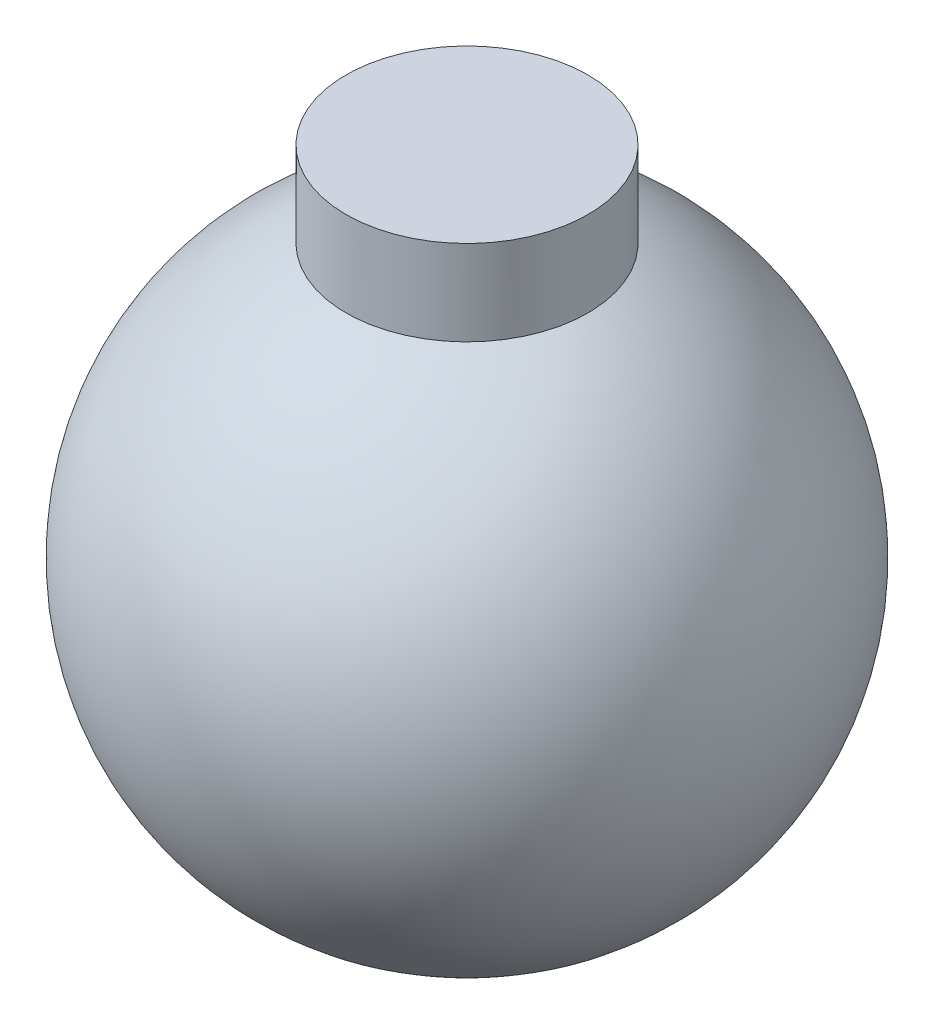
ISO-10303-21;
HEADER;
FILE_DESCRIPTION(('STEP AP214'),'2;1');
FILE_NAME('part.step','',(''),(''),'','','');
FILE_SCHEMA(('AUTOMOTIVE_DESIGN { 1 0 10303 214 1 1 1 1 }'));
ENDSEC;
DATA;
#1=APPLICATION_CONTEXT('core data for automotive mechanical design processes');
#2=APPLICATION_PROTOCOL_DEFINITION('international standard','automotive_design',2000,#1);
#3=PRODUCT_CONTEXT('',#1,'mechanical');
#4=PRODUCT('Part','Part','',(#3));
#5=PRODUCT_RELATED_PRODUCT_CATEGORY('part','',(#4));
#6=PRODUCT_DEFINITION_FORMATION('','',#4);
#7=PRODUCT_DEFINITION_CONTEXT('part definition',#1,'design');
#8=PRODUCT_DEFINITION('design','',#6,#7);
#9=PRODUCT_DEFINITION_SHAPE('','',#8);
#10=(LENGTH_UNIT() NAMED_UNIT(*) SI_UNIT(.MILLI.,.METRE.));
#11=(NAMED_UNIT(*) PLANE_ANGLE_UNIT() SI_UNIT($,.RADIAN.));
#12=(NAMED_UNIT(*) SI_UNIT($,.STERADIAN.) SOLID_ANGLE_UNIT());
#13=UNCERTAINTY_MEASURE_WITH_UNIT(LENGTH_MEASURE(1.E-05),#10,'distance_accuracy_value','');
#14=(GEOMETRIC_REPRESENTATION_CONTEXT(3) GLOBAL_UNCERTAINTY_ASSIGNED_CONTEXT((#13)) GLOBAL_UNIT_ASSIGNED_CONTEXT((#10,
#11,#12)) REPRESENTATION_CONTEXT('',''));
#15=CARTESIAN_POINT('',(0.,0.,0.));
#16=DIRECTION('',(0.,0.,1.));
#17=DIRECTION('',(1.,0.,0.));
#18=AXIS2_PLACEMENT_3D('',#15,#16,#17);
#19=CARTESIAN_POINT('',(0.,30.,0.));
#20=DIRECTION('',(0.,-1.,0.));
#21=DIRECTION('',(0.,0.,-1.));
#22=AXIS2_PLACEMENT_3D('',#19,#20,#21);
#23=CYLINDRICAL_SURFACE('',#22,10.1605808384512);
#24=CARTESIAN_POINT('',(0.,22.8421233037846,0.));
#25=DIRECTION('',(0.,-1.,0.));
#26=DIRECTION('',(0.,0.,-1.));
#27=AXIS2_PLACEMENT_3D('',#24,#25,#26);
#28=CIRCLE('',#27,10.1605808384512);
#29=CARTESIAN_POINT('',(0.,22.8421233037846,-10.1605808384512));
#30=VERTEX_POINT('',#29);
#31=EDGE_CURVE('E10',#30,#30,#28,.T.);
#32=ORIENTED_EDGE('',*,*,#31,.F.);
#33=EDGE_LOOP('',(#32));
#34=FACE_BOUND('',#33,.T.);
#35=CARTESIAN_POINT('',(0.,30.,0.));
#36=DIRECTION('',(0.,1.,0.));
#37=DIRECTION('',(0.,0.,1.));
#38=AXIS2_PLACEMENT_3D('',#35,#36,#37);
#39=CIRCLE('',#38,10.1605808384512);
#40=CARTESIAN_POINT('',(0.,30.,10.1605808384512));
#41=VERTEX_POINT('',#40);
#42=EDGE_CURVE('E45',#41,#41,#39,.T.);
#43=ORIENTED_EDGE('',*,*,#42,.F.);
#44=EDGE_LOOP('',(#43));
#45=FACE_BOUND('',#44,.T.);
#46=ADVANCED_FACE('F38',(#34,#45),#23,.T.);
#47=CARTESIAN_POINT('',(0.,30.,0.));
#48=DIRECTION('',(0.,1.,0.));
#49=DIRECTION('',(0.,0.,1.));
#50=AXIS2_PLACEMENT_3D('',#47,#48,#49);
#51=PLANE('',#50);
#52=ORIENTED_EDGE('',*,*,#42,.T.);
#53=EDGE_LOOP('',(#52));
#54=FACE_BOUND('',#53,.T.);
#55=ADVANCED_FACE('F51',(#54),#51,.T.);
#56=CARTESIAN_POINT('',(0.,0.,0.));
#57=DIRECTION('',(0.,0.,1.));
#58=DIRECTION('',(-1.,0.,0.));
#59=AXIS2_PLACEMENT_3D('',#56,#57,#58);
#60=SPHERICAL_SURFACE('',#59,25.);
#61=CARTESIAN_POINT('',(0.,0.,0.));
#62=DIRECTION('',(0.,-1.,0.));
#63=DIRECTION('',(0.,0.,-1.));
#64=AXIS2_PLACEMENT_3D('',#61,#62,#63);
#65=SPHERICAL_SURFACE('',#64,25.);
#66=ORIENTED_EDGE('',*,*,#31,.T.);
#67=EDGE_LOOP('',(#66));
#68=FACE_BOUND('',#67,.T.);
#69=ADVANCED_FACE('F40',(#68),#65,.T.);
#70=CLOSED_SHELL('',(#46,#55,#69));
#71=MANIFOLD_SOLID_BREP('B2',#70);
#72=ADVANCED_BREP_SHAPE_REPRESENTATION('',(#18,#71),#14);
#73=SHAPE_DEFINITION_REPRESENTATION(#9,#72);
ENDSEC;
END-ISO-10303-21;
